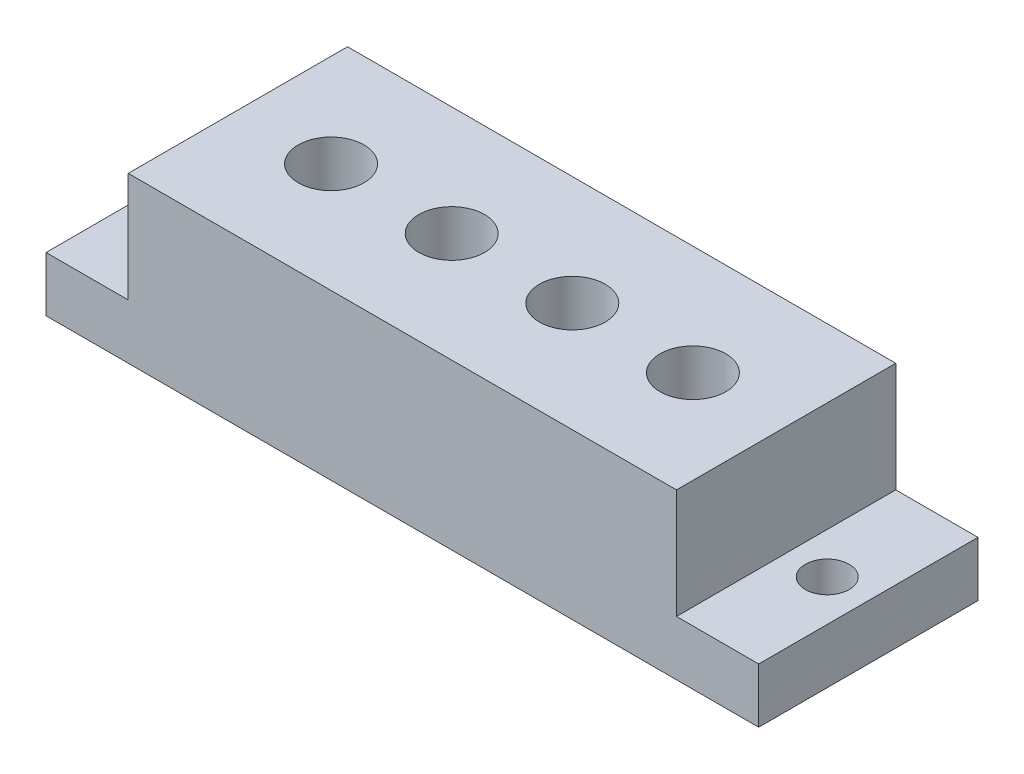
ISO-10303-21;
HEADER;
FILE_DESCRIPTION(('STEP AP214'),'2;1');
FILE_NAME('part.step','',(''),(''),'','','');
FILE_SCHEMA(('AUTOMOTIVE_DESIGN { 1 0 10303 214 1 1 1 1 }'));
ENDSEC;
DATA;
#1=APPLICATION_CONTEXT('core data for automotive mechanical design processes');
#2=APPLICATION_PROTOCOL_DEFINITION('international standard','automotive_design',2000,#1);
#3=PRODUCT_CONTEXT('',#1,'mechanical');
#4=PRODUCT('Part','Part','',(#3));
#5=PRODUCT_RELATED_PRODUCT_CATEGORY('part','',(#4));
#6=PRODUCT_DEFINITION_FORMATION('','',#4);
#7=PRODUCT_DEFINITION_CONTEXT('part definition',#1,'design');
#8=PRODUCT_DEFINITION('design','',#6,#7);
#9=PRODUCT_DEFINITION_SHAPE('','',#8);
#10=(LENGTH_UNIT() NAMED_UNIT(*) SI_UNIT(.MILLI.,.METRE.));
#11=(NAMED_UNIT(*) PLANE_ANGLE_UNIT() SI_UNIT($,.RADIAN.));
#12=(NAMED_UNIT(*) SI_UNIT($,.STERADIAN.) SOLID_ANGLE_UNIT());
#13=UNCERTAINTY_MEASURE_WITH_UNIT(LENGTH_MEASURE(1.E-05),#10,'distance_accuracy_value','');
#14=(GEOMETRIC_REPRESENTATION_CONTEXT(3) GLOBAL_UNCERTAINTY_ASSIGNED_CONTEXT((#13)) GLOBAL_UNIT_ASSIGNED_CONTEXT((#10,
#11,#12)) REPRESENTATION_CONTEXT('',''));
#15=CARTESIAN_POINT('',(0.,0.,0.));
#16=DIRECTION('',(0.,0.,1.));
#17=DIRECTION('',(1.,0.,0.));
#18=AXIS2_PLACEMENT_3D('',#15,#16,#17);
#19=CARTESIAN_POINT('',(0.,10.,0.));
#20=DIRECTION('',(0.,-1.,0.));
#21=DIRECTION('',(0.,0.,-1.));
#22=AXIS2_PLACEMENT_3D('',#19,#20,#21);
#23=PLANE('',#22);
#24=CARTESIAN_POINT('',(-57.5,10.,0.));
#25=DIRECTION('',(0.,-1.,0.));
#26=DIRECTION('',(0.,0.,-1.));
#27=AXIS2_PLACEMENT_3D('',#24,#25,#26);
#28=CIRCLE('',#27,4.);
#29=CARTESIAN_POINT('',(-57.5,10.,-4.));
#30=VERTEX_POINT('',#29);
#31=EDGE_CURVE('E228',#30,#30,#28,.T.);
#32=ORIENTED_EDGE('',*,*,#31,.T.);
#33=EDGE_LOOP('',(#32));
#34=FACE_BOUND('',#33,.T.);
#35=DIRECTION('',(0.,0.,1.));
#36=VECTOR('',#35,1.);
#37=CARTESIAN_POINT('',(-50.,10.,20.));
#38=LINE('',#37,#36);
#39=CARTESIAN_POINT('',(-50.,10.,-20.));
#40=VERTEX_POINT('',#39);
#41=CARTESIAN_POINT('',(-50.,10.,20.));
#42=VERTEX_POINT('',#41);
#43=EDGE_CURVE('E68',#40,#42,#38,.T.);
#44=ORIENTED_EDGE('',*,*,#43,.F.);
#45=DIRECTION('',(-1.,0.,0.));
#46=VECTOR('',#45,1.);
#47=CARTESIAN_POINT('',(-65.,10.,-20.));
#48=LINE('',#47,#46);
#49=CARTESIAN_POINT('',(-65.,10.,-20.));
#50=VERTEX_POINT('',#49);
#51=EDGE_CURVE('E167',#40,#50,#48,.T.);
#52=ORIENTED_EDGE('',*,*,#51,.T.);
#53=DIRECTION('',(0.,0.,1.));
#54=VECTOR('',#53,1.);
#55=CARTESIAN_POINT('',(-65.,10.,20.));
#56=LINE('',#55,#54);
#57=CARTESIAN_POINT('',(-65.,10.,20.));
#58=VERTEX_POINT('',#57);
#59=EDGE_CURVE('E155',#50,#58,#56,.T.);
#60=ORIENTED_EDGE('',*,*,#59,.T.);
#61=DIRECTION('',(1.,0.,0.));
#62=VECTOR('',#61,1.);
#63=CARTESIAN_POINT('',(65.,10.,20.));
#64=LINE('',#63,#62);
#65=EDGE_CURVE('E161',#58,#42,#64,.T.);
#66=ORIENTED_EDGE('',*,*,#65,.T.);
#67=EDGE_LOOP('',(#44,#52,#60,#66));
#68=FACE_BOUND('',#67,.T.);
#69=ADVANCED_FACE('F51',(#34,#68),#23,.F.);
#70=CARTESIAN_POINT('',(57.5,10.,0.));
#71=DIRECTION('',(0.,-1.,0.));
#72=DIRECTION('',(0.,0.,-1.));
#73=AXIS2_PLACEMENT_3D('',#70,#71,#72);
#74=CIRCLE('',#73,4.);
#75=CARTESIAN_POINT('',(57.5,10.,-4.));
#76=VERTEX_POINT('',#75);
#77=EDGE_CURVE('E226',#76,#76,#74,.T.);
#78=ORIENTED_EDGE('',*,*,#77,.T.);
#79=EDGE_LOOP('',(#78));
#80=FACE_BOUND('',#79,.T.);
#81=DIRECTION('',(0.,0.,-1.));
#82=VECTOR('',#81,1.);
#83=CARTESIAN_POINT('',(50.,10.,-20.));
#84=LINE('',#83,#82);
#85=CARTESIAN_POINT('',(50.,10.,20.));
#86=VERTEX_POINT('',#85);
#87=CARTESIAN_POINT('',(50.,10.,-20.));
#88=VERTEX_POINT('',#87);
#89=EDGE_CURVE('E76',#86,#88,#84,.T.);
#90=ORIENTED_EDGE('',*,*,#89,.F.);
#91=CARTESIAN_POINT('',(65.,10.,20.));
#92=VERTEX_POINT('',#91);
#93=EDGE_CURVE('E159',#86,#92,#64,.T.);
#94=ORIENTED_EDGE('',*,*,#93,.T.);
#95=DIRECTION('',(0.,0.,-1.));
#96=VECTOR('',#95,1.);
#97=CARTESIAN_POINT('',(65.,10.,-20.));
#98=LINE('',#97,#96);
#99=CARTESIAN_POINT('',(65.,10.,-20.));
#100=VERTEX_POINT('',#99);
#101=EDGE_CURVE('E164',#92,#100,#98,.T.);
#102=ORIENTED_EDGE('',*,*,#101,.T.);
#103=EDGE_CURVE('E168',#100,#88,#48,.T.);
#104=ORIENTED_EDGE('',*,*,#103,.T.);
#105=EDGE_LOOP('',(#90,#94,#102,#104));
#106=FACE_BOUND('',#105,.T.);
#107=ADVANCED_FACE('F279',(#80,#106),#23,.F.);
#108=CARTESIAN_POINT('',(-65.,10.,20.));
#109=DIRECTION('',(1.,0.,0.));
#110=DIRECTION('',(0.,0.,-1.));
#111=AXIS2_PLACEMENT_3D('',#108,#109,#110);
#112=PLANE('',#111);
#113=DIRECTION('',(0.,0.,1.));
#114=VECTOR('',#113,1.);
#115=CARTESIAN_POINT('',(-65.,0.,20.));
#116=LINE('',#115,#114);
#117=CARTESIAN_POINT('',(-65.,0.,-20.));
#118=VERTEX_POINT('',#117);
#119=CARTESIAN_POINT('',(-65.,0.,20.));
#120=VERTEX_POINT('',#119);
#121=EDGE_CURVE('E142',#118,#120,#116,.T.);
#122=ORIENTED_EDGE('',*,*,#121,.T.);
#123=DIRECTION('',(0.,-1.,0.));
#124=VECTOR('',#123,1.);
#125=CARTESIAN_POINT('',(-65.,10.,20.));
#126=LINE('',#125,#124);
#127=EDGE_CURVE('E11',#58,#120,#126,.T.);
#128=ORIENTED_EDGE('',*,*,#127,.F.);
#129=ORIENTED_EDGE('',*,*,#59,.F.);
#130=DIRECTION('',(0.,-1.,0.));
#131=VECTOR('',#130,1.);
#132=CARTESIAN_POINT('',(-65.,10.,-20.));
#133=LINE('',#132,#131);
#134=EDGE_CURVE('E170',#50,#118,#133,.T.);
#135=ORIENTED_EDGE('',*,*,#134,.T.);
#136=EDGE_LOOP('',(#122,#128,#129,#135));
#137=FACE_BOUND('',#136,.T.);
#138=ADVANCED_FACE('F54',(#137),#112,.F.);
#139=CARTESIAN_POINT('',(65.,10.,20.));
#140=DIRECTION('',(0.,0.,-1.));
#141=DIRECTION('',(-1.,0.,0.));
#142=AXIS2_PLACEMENT_3D('',#139,#140,#141);
#143=PLANE('',#142);
#144=DIRECTION('',(1.,0.,0.));
#145=VECTOR('',#144,1.);
#146=CARTESIAN_POINT('',(65.,0.,20.));
#147=LINE('',#146,#145);
#148=CARTESIAN_POINT('',(65.,0.,20.));
#149=VERTEX_POINT('',#148);
#150=EDGE_CURVE('E148',#120,#149,#147,.T.);
#151=ORIENTED_EDGE('',*,*,#150,.T.);
#152=DIRECTION('',(0.,-1.,0.));
#153=VECTOR('',#152,1.);
#154=CARTESIAN_POINT('',(65.,10.,20.));
#155=LINE('',#154,#153);
#156=EDGE_CURVE('E61',#92,#149,#155,.T.);
#157=ORIENTED_EDGE('',*,*,#156,.F.);
#158=ORIENTED_EDGE('',*,*,#93,.F.);
#159=DIRECTION('',(0.,-1.,0.));
#160=VECTOR('',#159,1.);
#161=CARTESIAN_POINT('',(50.,30.,20.));
#162=LINE('',#161,#160);
#163=CARTESIAN_POINT('',(50.,30.,20.));
#164=VERTEX_POINT('',#163);
#165=EDGE_CURVE('E124',#164,#86,#162,.T.);
#166=ORIENTED_EDGE('',*,*,#165,.F.);
#167=DIRECTION('',(1.,0.,0.));
#168=VECTOR('',#167,1.);
#169=CARTESIAN_POINT('',(50.,30.,20.));
#170=LINE('',#169,#168);
#171=CARTESIAN_POINT('',(-50.,30.,20.));
#172=VERTEX_POINT('',#171);
#173=EDGE_CURVE('E118',#172,#164,#170,.T.);
#174=ORIENTED_EDGE('',*,*,#173,.F.);
#175=DIRECTION('',(0.,-1.,0.));
#176=VECTOR('',#175,1.);
#177=CARTESIAN_POINT('',(-50.,30.,20.));
#178=LINE('',#177,#176);
#179=EDGE_CURVE('E122',#172,#42,#178,.T.);
#180=ORIENTED_EDGE('',*,*,#179,.T.);
#181=ORIENTED_EDGE('',*,*,#65,.F.);
#182=ORIENTED_EDGE('',*,*,#127,.T.);
#183=EDGE_LOOP('',(#151,#157,#158,#166,#174,#180,#181,#182));
#184=FACE_BOUND('',#183,.T.);
#185=ADVANCED_FACE('F120',(#184),#143,.F.);
#186=CARTESIAN_POINT('',(65.,10.,-20.));
#187=DIRECTION('',(-1.,0.,0.));
#188=DIRECTION('',(0.,0.,1.));
#189=AXIS2_PLACEMENT_3D('',#186,#187,#188);
#190=PLANE('',#189);
#191=DIRECTION('',(0.,0.,-1.));
#192=VECTOR('',#191,1.);
#193=CARTESIAN_POINT('',(65.,0.,-20.));
#194=LINE('',#193,#192);
#195=CARTESIAN_POINT('',(65.,0.,-20.));
#196=VERTEX_POINT('',#195);
#197=EDGE_CURVE('E174',#149,#196,#194,.T.);
#198=ORIENTED_EDGE('',*,*,#197,.T.);
#199=DIRECTION('',(0.,-1.,0.));
#200=VECTOR('',#199,1.);
#201=CARTESIAN_POINT('',(65.,10.,-20.));
#202=LINE('',#201,#200);
#203=EDGE_CURVE('E182',#100,#196,#202,.T.);
#204=ORIENTED_EDGE('',*,*,#203,.F.);
#205=ORIENTED_EDGE('',*,*,#101,.F.);
#206=ORIENTED_EDGE('',*,*,#156,.T.);
#207=EDGE_LOOP('',(#198,#204,#205,#206));
#208=FACE_BOUND('',#207,.T.);
#209=ADVANCED_FACE('F192',(#208),#190,.F.);
#210=CARTESIAN_POINT('',(-65.,10.,-20.));
#211=DIRECTION('',(0.,0.,1.));
#212=DIRECTION('',(1.,0.,0.));
#213=AXIS2_PLACEMENT_3D('',#210,#211,#212);
#214=PLANE('',#213);
#215=DIRECTION('',(-1.,0.,0.));
#216=VECTOR('',#215,1.);
#217=CARTESIAN_POINT('',(-65.,0.,-20.));
#218=LINE('',#217,#216);
#219=EDGE_CURVE('E160',#196,#118,#218,.T.);
#220=ORIENTED_EDGE('',*,*,#219,.T.);
#221=ORIENTED_EDGE('',*,*,#134,.F.);
#222=ORIENTED_EDGE('',*,*,#51,.F.);
#223=DIRECTION('',(0.,-1.,0.));
#224=VECTOR('',#223,1.);
#225=CARTESIAN_POINT('',(-50.,30.,-20.));
#226=LINE('',#225,#224);
#227=CARTESIAN_POINT('',(-50.,30.,-20.));
#228=VERTEX_POINT('',#227);
#229=EDGE_CURVE('E224',#228,#40,#226,.T.);
#230=ORIENTED_EDGE('',*,*,#229,.F.);
#231=DIRECTION('',(-1.,0.,0.));
#232=VECTOR('',#231,1.);
#233=CARTESIAN_POINT('',(-50.,30.,-20.));
#234=LINE('',#233,#232);
#235=CARTESIAN_POINT('',(50.,30.,-20.));
#236=VERTEX_POINT('',#235);
#237=EDGE_CURVE('E134',#236,#228,#234,.T.);
#238=ORIENTED_EDGE('',*,*,#237,.F.);
#239=DIRECTION('',(0.,-1.,0.));
#240=VECTOR('',#239,1.);
#241=CARTESIAN_POINT('',(50.,30.,-20.));
#242=LINE('',#241,#240);
#243=EDGE_CURVE('E151',#236,#88,#242,.T.);
#244=ORIENTED_EDGE('',*,*,#243,.T.);
#245=ORIENTED_EDGE('',*,*,#103,.F.);
#246=ORIENTED_EDGE('',*,*,#203,.T.);
#247=EDGE_LOOP('',(#220,#221,#222,#230,#238,#244,#245,#246));
#248=FACE_BOUND('',#247,.T.);
#249=ADVANCED_FACE('F200',(#248),#214,.F.);
#250=CARTESIAN_POINT('',(0.,0.,0.));
#251=DIRECTION('',(0.,-1.,0.));
#252=DIRECTION('',(0.,0.,-1.));
#253=AXIS2_PLACEMENT_3D('',#250,#251,#252);
#254=PLANE('',#253);
#255=CARTESIAN_POINT('',(-57.5,0.,0.));
#256=DIRECTION('',(0.,1.,0.));
#257=DIRECTION('',(0.,0.,1.));
#258=AXIS2_PLACEMENT_3D('',#255,#256,#257);
#259=CIRCLE('',#258,4.);
#260=CARTESIAN_POINT('',(-57.5,0.,4.));
#261=VERTEX_POINT('',#260);
#262=EDGE_CURVE('E229',#261,#261,#259,.T.);
#263=ORIENTED_EDGE('',*,*,#262,.T.);
#264=EDGE_LOOP('',(#263));
#265=FACE_BOUND('',#264,.T.);
#266=CARTESIAN_POINT('',(57.5,0.,0.));
#267=DIRECTION('',(0.,1.,0.));
#268=DIRECTION('',(0.,0.,1.));
#269=AXIS2_PLACEMENT_3D('',#266,#267,#268);
#270=CIRCLE('',#269,4.);
#271=CARTESIAN_POINT('',(57.5,0.,4.));
#272=VERTEX_POINT('',#271);
#273=EDGE_CURVE('E239',#272,#272,#270,.T.);
#274=ORIENTED_EDGE('',*,*,#273,.T.);
#275=EDGE_LOOP('',(#274));
#276=FACE_BOUND('',#275,.T.);
#277=ORIENTED_EDGE('',*,*,#121,.F.);
#278=ORIENTED_EDGE('',*,*,#219,.F.);
#279=ORIENTED_EDGE('',*,*,#197,.F.);
#280=ORIENTED_EDGE('',*,*,#150,.F.);
#281=EDGE_LOOP('',(#277,#278,#279,#280));
#282=FACE_BOUND('',#281,.T.);
#283=ADVANCED_FACE('F197',(#265,#276,#282),#254,.T.);
#284=CARTESIAN_POINT('',(-50.,30.,20.));
#285=DIRECTION('',(1.,0.,0.));
#286=DIRECTION('',(0.,0.,-1.));
#287=AXIS2_PLACEMENT_3D('',#284,#285,#286);
#288=PLANE('',#287);
#289=ORIENTED_EDGE('',*,*,#43,.T.);
#290=ORIENTED_EDGE('',*,*,#179,.F.);
#291=DIRECTION('',(0.,0.,1.));
#292=VECTOR('',#291,1.);
#293=CARTESIAN_POINT('',(-50.,30.,20.));
#294=LINE('',#293,#292);
#295=EDGE_CURVE('E129',#228,#172,#294,.T.);
#296=ORIENTED_EDGE('',*,*,#295,.F.);
#297=ORIENTED_EDGE('',*,*,#229,.T.);
#298=EDGE_LOOP('',(#289,#290,#296,#297));
#299=FACE_BOUND('',#298,.T.);
#300=ADVANCED_FACE('F140',(#299),#288,.F.);
#301=CARTESIAN_POINT('',(50.,30.,-20.));
#302=DIRECTION('',(-1.,0.,0.));
#303=DIRECTION('',(0.,0.,1.));
#304=AXIS2_PLACEMENT_3D('',#301,#302,#303);
#305=PLANE('',#304);
#306=ORIENTED_EDGE('',*,*,#89,.T.);
#307=ORIENTED_EDGE('',*,*,#243,.F.);
#308=DIRECTION('',(0.,0.,-1.));
#309=VECTOR('',#308,1.);
#310=CARTESIAN_POINT('',(50.,30.,-20.));
#311=LINE('',#310,#309);
#312=EDGE_CURVE('E128',#164,#236,#311,.T.);
#313=ORIENTED_EDGE('',*,*,#312,.F.);
#314=ORIENTED_EDGE('',*,*,#165,.T.);
#315=EDGE_LOOP('',(#306,#307,#313,#314));
#316=FACE_BOUND('',#315,.T.);
#317=ADVANCED_FACE('F267',(#316),#305,.F.);
#318=CARTESIAN_POINT('',(0.,30.,0.));
#319=DIRECTION('',(0.,-1.,0.));
#320=DIRECTION('',(0.,0.,-1.));
#321=AXIS2_PLACEMENT_3D('',#318,#319,#320);
#322=PLANE('',#321);
#323=CARTESIAN_POINT('',(-33.,30.,0.));
#324=DIRECTION('',(0.,1.,0.));
#325=DIRECTION('',(0.,0.,1.));
#326=AXIS2_PLACEMENT_3D('',#323,#324,#325);
#327=CIRCLE('',#326,6.);
#328=CARTESIAN_POINT('',(-33.,30.,6.));
#329=VERTEX_POINT('',#328);
#330=EDGE_CURVE('E217',#329,#329,#327,.T.);
#331=ORIENTED_EDGE('',*,*,#330,.F.);
#332=EDGE_LOOP('',(#331));
#333=FACE_BOUND('',#332,.T.);
#334=CARTESIAN_POINT('',(-11.,30.,0.));
#335=DIRECTION('',(0.,1.,0.));
#336=DIRECTION('',(0.,0.,1.));
#337=AXIS2_PLACEMENT_3D('',#334,#335,#336);
#338=CIRCLE('',#337,6.);
#339=CARTESIAN_POINT('',(-11.,30.,6.));
#340=VERTEX_POINT('',#339);
#341=EDGE_CURVE('E214',#340,#340,#338,.T.);
#342=ORIENTED_EDGE('',*,*,#341,.F.);
#343=EDGE_LOOP('',(#342));
#344=FACE_BOUND('',#343,.T.);
#345=CARTESIAN_POINT('',(11.,30.,0.));
#346=DIRECTION('',(0.,1.,0.));
#347=DIRECTION('',(0.,0.,1.));
#348=AXIS2_PLACEMENT_3D('',#345,#346,#347);
#349=CIRCLE('',#348,6.);
#350=CARTESIAN_POINT('',(11.,30.,6.));
#351=VERTEX_POINT('',#350);
#352=EDGE_CURVE('E209',#351,#351,#349,.T.);
#353=ORIENTED_EDGE('',*,*,#352,.F.);
#354=EDGE_LOOP('',(#353));
#355=FACE_BOUND('',#354,.T.);
#356=CARTESIAN_POINT('',(33.,30.,0.));
#357=DIRECTION('',(0.,1.,0.));
#358=DIRECTION('',(0.,0.,1.));
#359=AXIS2_PLACEMENT_3D('',#356,#357,#358);
#360=CIRCLE('',#359,6.);
#361=CARTESIAN_POINT('',(33.,30.,6.));
#362=VERTEX_POINT('',#361);
#363=EDGE_CURVE('E220',#362,#362,#360,.T.);
#364=ORIENTED_EDGE('',*,*,#363,.F.);
#365=EDGE_LOOP('',(#364));
#366=FACE_BOUND('',#365,.T.);
#367=ORIENTED_EDGE('',*,*,#295,.T.);
#368=ORIENTED_EDGE('',*,*,#173,.T.);
#369=ORIENTED_EDGE('',*,*,#312,.T.);
#370=ORIENTED_EDGE('',*,*,#237,.T.);
#371=EDGE_LOOP('',(#367,#368,#369,#370));
#372=FACE_BOUND('',#371,.T.);
#373=ADVANCED_FACE('F132',(#333,#344,#355,#366,#372),#322,.F.);
#374=CARTESIAN_POINT('',(33.,10.,0.));
#375=DIRECTION('',(0.,1.,0.));
#376=DIRECTION('',(0.,0.,1.));
#377=AXIS2_PLACEMENT_3D('',#374,#375,#376);
#378=CYLINDRICAL_SURFACE('',#377,6.);
#379=CARTESIAN_POINT('',(33.,10.,0.));
#380=DIRECTION('',(0.,1.,0.));
#381=DIRECTION('',(0.,0.,1.));
#382=AXIS2_PLACEMENT_3D('',#379,#380,#381);
#383=CIRCLE('',#382,6.);
#384=CARTESIAN_POINT('',(33.,10.,6.));
#385=VERTEX_POINT('',#384);
#386=EDGE_CURVE('E235',#385,#385,#383,.T.);
#387=ORIENTED_EDGE('',*,*,#386,.F.);
#388=EDGE_LOOP('',(#387));
#389=FACE_BOUND('',#388,.T.);
#390=ORIENTED_EDGE('',*,*,#363,.T.);
#391=EDGE_LOOP('',(#390));
#392=FACE_BOUND('',#391,.T.);
#393=ADVANCED_FACE('F273',(#389,#392),#378,.F.);
#394=CARTESIAN_POINT('',(33.,10.,0.));
#395=DIRECTION('',(0.,1.,0.));
#396=DIRECTION('',(0.,0.,1.));
#397=AXIS2_PLACEMENT_3D('',#394,#395,#396);
#398=PLANE('',#397);
#399=ORIENTED_EDGE('',*,*,#386,.T.);
#400=EDGE_LOOP('',(#399));
#401=FACE_BOUND('',#400,.T.);
#402=ADVANCED_FACE('F378',(#401),#398,.T.);
#403=CARTESIAN_POINT('',(11.,10.,0.));
#404=DIRECTION('',(0.,1.,0.));
#405=DIRECTION('',(0.,0.,1.));
#406=AXIS2_PLACEMENT_3D('',#403,#404,#405);
#407=CYLINDRICAL_SURFACE('',#406,6.);
#408=CARTESIAN_POINT('',(11.,10.,0.));
#409=DIRECTION('',(0.,1.,0.));
#410=DIRECTION('',(0.,0.,1.));
#411=AXIS2_PLACEMENT_3D('',#408,#409,#410);
#412=CIRCLE('',#411,6.);
#413=CARTESIAN_POINT('',(11.,10.,6.));
#414=VERTEX_POINT('',#413);
#415=EDGE_CURVE('E212',#414,#414,#412,.T.);
#416=ORIENTED_EDGE('',*,*,#415,.F.);
#417=EDGE_LOOP('',(#416));
#418=FACE_BOUND('',#417,.T.);
#419=ORIENTED_EDGE('',*,*,#352,.T.);
#420=EDGE_LOOP('',(#419));
#421=FACE_BOUND('',#420,.T.);
#422=ADVANCED_FACE('F367',(#418,#421),#407,.F.);
#423=CARTESIAN_POINT('',(11.,10.,0.));
#424=DIRECTION('',(0.,1.,0.));
#425=DIRECTION('',(0.,0.,1.));
#426=AXIS2_PLACEMENT_3D('',#423,#424,#425);
#427=PLANE('',#426);
#428=ORIENTED_EDGE('',*,*,#415,.T.);
#429=EDGE_LOOP('',(#428));
#430=FACE_BOUND('',#429,.T.);
#431=ADVANCED_FACE('F356',(#430),#427,.T.);
#432=CARTESIAN_POINT('',(-11.,10.,0.));
#433=DIRECTION('',(0.,1.,0.));
#434=DIRECTION('',(0.,0.,1.));
#435=AXIS2_PLACEMENT_3D('',#432,#433,#434);
#436=CYLINDRICAL_SURFACE('',#435,6.);
#437=CARTESIAN_POINT('',(-11.,10.,0.));
#438=DIRECTION('',(0.,1.,0.));
#439=DIRECTION('',(0.,0.,1.));
#440=AXIS2_PLACEMENT_3D('',#437,#438,#439);
#441=CIRCLE('',#440,6.);
#442=CARTESIAN_POINT('',(-11.,10.,6.));
#443=VERTEX_POINT('',#442);
#444=EDGE_CURVE('E207',#443,#443,#441,.T.);
#445=ORIENTED_EDGE('',*,*,#444,.F.);
#446=EDGE_LOOP('',(#445));
#447=FACE_BOUND('',#446,.T.);
#448=ORIENTED_EDGE('',*,*,#341,.T.);
#449=EDGE_LOOP('',(#448));
#450=FACE_BOUND('',#449,.T.);
#451=ADVANCED_FACE('F345',(#447,#450),#436,.F.);
#452=CARTESIAN_POINT('',(-11.,10.,0.));
#453=DIRECTION('',(0.,1.,0.));
#454=DIRECTION('',(0.,0.,1.));
#455=AXIS2_PLACEMENT_3D('',#452,#453,#454);
#456=PLANE('',#455);
#457=ORIENTED_EDGE('',*,*,#444,.T.);
#458=EDGE_LOOP('',(#457));
#459=FACE_BOUND('',#458,.T.);
#460=ADVANCED_FACE('F334',(#459),#456,.T.);
#461=CARTESIAN_POINT('',(-33.,10.,0.));
#462=DIRECTION('',(0.,1.,0.));
#463=DIRECTION('',(0.,0.,1.));
#464=AXIS2_PLACEMENT_3D('',#461,#462,#463);
#465=CYLINDRICAL_SURFACE('',#464,6.);
#466=CARTESIAN_POINT('',(-33.,10.,0.));
#467=DIRECTION('',(0.,1.,0.));
#468=DIRECTION('',(0.,0.,1.));
#469=AXIS2_PLACEMENT_3D('',#466,#467,#468);
#470=CIRCLE('',#469,6.);
#471=CARTESIAN_POINT('',(-33.,10.,6.));
#472=VERTEX_POINT('',#471);
#473=EDGE_CURVE('E243',#472,#472,#470,.T.);
#474=ORIENTED_EDGE('',*,*,#473,.F.);
#475=EDGE_LOOP('',(#474));
#476=FACE_BOUND('',#475,.T.);
#477=ORIENTED_EDGE('',*,*,#330,.T.);
#478=EDGE_LOOP('',(#477));
#479=FACE_BOUND('',#478,.T.);
#480=ADVANCED_FACE('F321',(#476,#479),#465,.F.);
#481=CARTESIAN_POINT('',(-33.,10.,0.));
#482=DIRECTION('',(0.,1.,0.));
#483=DIRECTION('',(0.,0.,1.));
#484=AXIS2_PLACEMENT_3D('',#481,#482,#483);
#485=PLANE('',#484);
#486=ORIENTED_EDGE('',*,*,#473,.T.);
#487=EDGE_LOOP('',(#486));
#488=FACE_BOUND('',#487,.T.);
#489=ADVANCED_FACE('F314',(#488),#485,.T.);
#490=CARTESIAN_POINT('',(57.5,0.,0.));
#491=DIRECTION('',(0.,1.,0.));
#492=DIRECTION('',(0.,0.,1.));
#493=AXIS2_PLACEMENT_3D('',#490,#491,#492);
#494=CYLINDRICAL_SURFACE('',#493,4.);
#495=ORIENTED_EDGE('',*,*,#273,.F.);
#496=EDGE_LOOP('',(#495));
#497=FACE_BOUND('',#496,.T.);
#498=ORIENTED_EDGE('',*,*,#77,.F.);
#499=EDGE_LOOP('',(#498));
#500=FACE_BOUND('',#499,.T.);
#501=ADVANCED_FACE('F320',(#497,#500),#494,.F.);
#502=CARTESIAN_POINT('',(-57.5,0.,0.));
#503=DIRECTION('',(0.,1.,0.));
#504=DIRECTION('',(0.,0.,1.));
#505=AXIS2_PLACEMENT_3D('',#502,#503,#504);
#506=CYLINDRICAL_SURFACE('',#505,4.);
#507=ORIENTED_EDGE('',*,*,#262,.F.);
#508=EDGE_LOOP('',(#507));
#509=FACE_BOUND('',#508,.T.);
#510=ORIENTED_EDGE('',*,*,#31,.F.);
#511=EDGE_LOOP('',(#510));
#512=FACE_BOUND('',#511,.T.);
#513=ADVANCED_FACE('F474',(#509,#512),#506,.F.);
#514=CLOSED_SHELL('',(#69,#107,#138,#185,#209,#249,#283,#300,#317,#373,#393,#402,#422,#431,#451,
#460,#480,#489,#501,#513));
#515=MANIFOLD_SOLID_BREP('B2',#514);
#516=ADVANCED_BREP_SHAPE_REPRESENTATION('',(#18,#515),#14);
#517=SHAPE_DEFINITION_REPRESENTATION(#9,#516);
ENDSEC;
END-ISO-10303-21;
